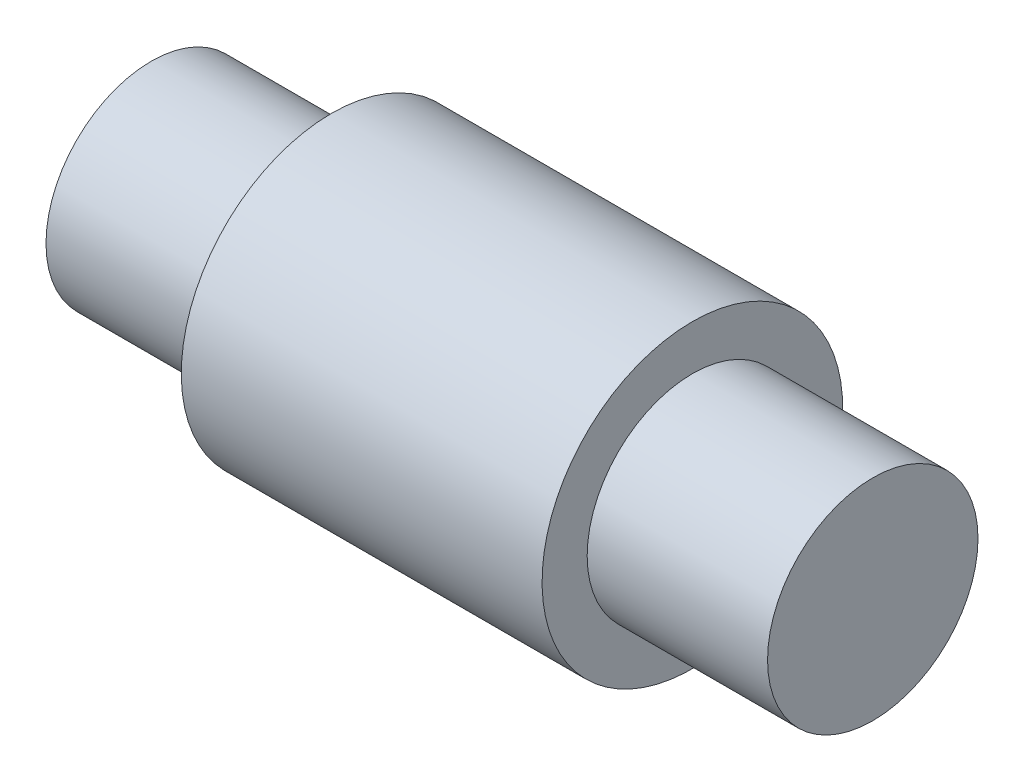
ISO-10303-21;
HEADER;
FILE_DESCRIPTION(('STEP AP214'),'2;1');
FILE_NAME('part.step','',(''),(''),'','','');
FILE_SCHEMA(('AUTOMOTIVE_DESIGN { 1 0 10303 214 1 1 1 1 }'));
ENDSEC;
DATA;
#1=APPLICATION_CONTEXT('core data for automotive mechanical design processes');
#2=APPLICATION_PROTOCOL_DEFINITION('international standard','automotive_design',2000,#1);
#3=PRODUCT_CONTEXT('',#1,'mechanical');
#4=PRODUCT('Part','Part','',(#3));
#5=PRODUCT_RELATED_PRODUCT_CATEGORY('part','',(#4));
#6=PRODUCT_DEFINITION_FORMATION('','',#4);
#7=PRODUCT_DEFINITION_CONTEXT('part definition',#1,'design');
#8=PRODUCT_DEFINITION('design','',#6,#7);
#9=PRODUCT_DEFINITION_SHAPE('','',#8);
#10=(LENGTH_UNIT() NAMED_UNIT(*) SI_UNIT(.MILLI.,.METRE.));
#11=(NAMED_UNIT(*) PLANE_ANGLE_UNIT() SI_UNIT($,.RADIAN.));
#12=(NAMED_UNIT(*) SI_UNIT($,.STERADIAN.) SOLID_ANGLE_UNIT());
#13=UNCERTAINTY_MEASURE_WITH_UNIT(LENGTH_MEASURE(1.E-05),#10,'distance_accuracy_value','');
#14=(GEOMETRIC_REPRESENTATION_CONTEXT(3) GLOBAL_UNCERTAINTY_ASSIGNED_CONTEXT((#13)) GLOBAL_UNIT_ASSIGNED_CONTEXT((#10,
#11,#12)) REPRESENTATION_CONTEXT('',''));
#15=CARTESIAN_POINT('',(0.,0.,0.));
#16=DIRECTION('',(0.,0.,1.));
#17=DIRECTION('',(1.,0.,0.));
#18=AXIS2_PLACEMENT_3D('',#15,#16,#17);
#19=CARTESIAN_POINT('',(0.,0.,0.));
#20=DIRECTION('',(-1.,0.,0.));
#21=DIRECTION('',(0.,-1.,0.));
#22=AXIS2_PLACEMENT_3D('',#19,#20,#21);
#23=PLANE('',#22);
#24=CARTESIAN_POINT('',(0.,0.,0.));
#25=DIRECTION('',(1.,0.,0.));
#26=DIRECTION('',(0.,1.,0.));
#27=AXIS2_PLACEMENT_3D('',#24,#25,#26);
#28=CIRCLE('',#27,3.5);
#29=CARTESIAN_POINT('',(0.,3.5,0.));
#30=VERTEX_POINT('',#29);
#31=EDGE_CURVE('E10',#30,#30,#28,.T.);
#32=ORIENTED_EDGE('',*,*,#31,.F.);
#33=EDGE_LOOP('',(#32));
#34=FACE_BOUND('',#33,.T.);
#35=ADVANCED_FACE('F37',(#34),#23,.T.);
#36=CARTESIAN_POINT('',(24.,0.,0.));
#37=DIRECTION('',(1.,0.,0.));
#38=DIRECTION('',(0.,1.,0.));
#39=AXIS2_PLACEMENT_3D('',#36,#37,#38);
#40=CYLINDRICAL_SURFACE('',#39,3.5);
#41=ORIENTED_EDGE('',*,*,#31,.T.);
#42=EDGE_LOOP('',(#41));
#43=FACE_BOUND('',#42,.T.);
#44=CARTESIAN_POINT('',(6.,0.,0.));
#45=DIRECTION('',(1.,0.,0.));
#46=DIRECTION('',(0.,1.,0.));
#47=AXIS2_PLACEMENT_3D('',#44,#45,#46);
#48=CIRCLE('',#47,3.5);
#49=CARTESIAN_POINT('',(6.,3.5,0.));
#50=VERTEX_POINT('',#49);
#51=EDGE_CURVE('E44',#50,#50,#48,.T.);
#52=ORIENTED_EDGE('',*,*,#51,.F.);
#53=EDGE_LOOP('',(#52));
#54=FACE_BOUND('',#53,.T.);
#55=ADVANCED_FACE('F85',(#43,#54),#40,.T.);
#56=CARTESIAN_POINT('',(6.,3.5,0.));
#57=DIRECTION('',(-1.,0.,0.));
#58=DIRECTION('',(0.,-1.,0.));
#59=AXIS2_PLACEMENT_3D('',#56,#57,#58);
#60=PLANE('',#59);
#61=ORIENTED_EDGE('',*,*,#51,.T.);
#62=EDGE_LOOP('',(#61));
#63=FACE_BOUND('',#62,.T.);
#64=CARTESIAN_POINT('',(6.,0.,0.));
#65=DIRECTION('',(1.,0.,0.));
#66=DIRECTION('',(0.,1.,0.));
#67=AXIS2_PLACEMENT_3D('',#64,#65,#66);
#68=CIRCLE('',#67,5.);
#69=CARTESIAN_POINT('',(6.,5.,0.));
#70=VERTEX_POINT('',#69);
#71=EDGE_CURVE('E49',#70,#70,#68,.T.);
#72=ORIENTED_EDGE('',*,*,#71,.F.);
#73=EDGE_LOOP('',(#72));
#74=FACE_BOUND('',#73,.T.);
#75=ADVANCED_FACE('F90',(#63,#74),#60,.T.);
#76=CARTESIAN_POINT('',(24.,0.,0.));
#77=DIRECTION('',(1.,0.,0.));
#78=DIRECTION('',(0.,1.,0.));
#79=AXIS2_PLACEMENT_3D('',#76,#77,#78);
#80=CYLINDRICAL_SURFACE('',#79,5.);
#81=ORIENTED_EDGE('',*,*,#71,.T.);
#82=EDGE_LOOP('',(#81));
#83=FACE_BOUND('',#82,.T.);
#84=CARTESIAN_POINT('',(18.,0.,0.));
#85=DIRECTION('',(1.,0.,0.));
#86=DIRECTION('',(0.,1.,0.));
#87=AXIS2_PLACEMENT_3D('',#84,#85,#86);
#88=CIRCLE('',#87,5.);
#89=CARTESIAN_POINT('',(18.,5.,0.));
#90=VERTEX_POINT('',#89);
#91=EDGE_CURVE('E54',#90,#90,#88,.T.);
#92=ORIENTED_EDGE('',*,*,#91,.F.);
#93=EDGE_LOOP('',(#92));
#94=FACE_BOUND('',#93,.T.);
#95=ADVANCED_FACE('F81',(#83,#94),#80,.T.);
#96=CARTESIAN_POINT('',(18.,5.,0.));
#97=DIRECTION('',(1.,0.,0.));
#98=DIRECTION('',(0.,1.,0.));
#99=AXIS2_PLACEMENT_3D('',#96,#97,#98);
#100=PLANE('',#99);
#101=ORIENTED_EDGE('',*,*,#91,.T.);
#102=EDGE_LOOP('',(#101));
#103=FACE_BOUND('',#102,.T.);
#104=CARTESIAN_POINT('',(18.,0.,0.));
#105=DIRECTION('',(1.,0.,0.));
#106=DIRECTION('',(0.,1.,0.));
#107=AXIS2_PLACEMENT_3D('',#104,#105,#106);
#108=CIRCLE('',#107,3.5);
#109=CARTESIAN_POINT('',(18.,3.5,0.));
#110=VERTEX_POINT('',#109);
#111=EDGE_CURVE('E60',#110,#110,#108,.T.);
#112=ORIENTED_EDGE('',*,*,#111,.F.);
#113=EDGE_LOOP('',(#112));
#114=FACE_BOUND('',#113,.T.);
#115=ADVANCED_FACE('F73',(#103,#114),#100,.T.);
#116=CARTESIAN_POINT('',(24.,0.,0.));
#117=DIRECTION('',(1.,0.,0.));
#118=DIRECTION('',(0.,1.,0.));
#119=AXIS2_PLACEMENT_3D('',#116,#117,#118);
#120=CYLINDRICAL_SURFACE('',#119,3.5);
#121=ORIENTED_EDGE('',*,*,#111,.T.);
#122=EDGE_LOOP('',(#121));
#123=FACE_BOUND('',#122,.T.);
#124=CARTESIAN_POINT('',(24.,0.,0.));
#125=DIRECTION('',(1.,0.,0.));
#126=DIRECTION('',(0.,1.,0.));
#127=AXIS2_PLACEMENT_3D('',#124,#125,#126);
#128=CIRCLE('',#127,3.5);
#129=CARTESIAN_POINT('',(24.,3.5,0.));
#130=VERTEX_POINT('',#129);
#131=EDGE_CURVE('E64',#130,#130,#128,.T.);
#132=ORIENTED_EDGE('',*,*,#131,.F.);
#133=EDGE_LOOP('',(#132));
#134=FACE_BOUND('',#133,.T.);
#135=ADVANCED_FACE('F71',(#123,#134),#120,.T.);
#136=CARTESIAN_POINT('',(24.,3.5,0.));
#137=DIRECTION('',(1.,0.,0.));
#138=DIRECTION('',(0.,1.,0.));
#139=AXIS2_PLACEMENT_3D('',#136,#137,#138);
#140=PLANE('',#139);
#141=ORIENTED_EDGE('',*,*,#131,.T.);
#142=EDGE_LOOP('',(#141));
#143=FACE_BOUND('',#142,.T.);
#144=ADVANCED_FACE('F69',(#143),#140,.T.);
#145=CLOSED_SHELL('',(#35,#55,#75,#95,#115,#135,#144));
#146=MANIFOLD_SOLID_BREP('B2',#145);
#147=ADVANCED_BREP_SHAPE_REPRESENTATION('',(#18,#146),#14);
#148=SHAPE_DEFINITION_REPRESENTATION(#9,#147);
ENDSEC;
END-ISO-10303-21;
